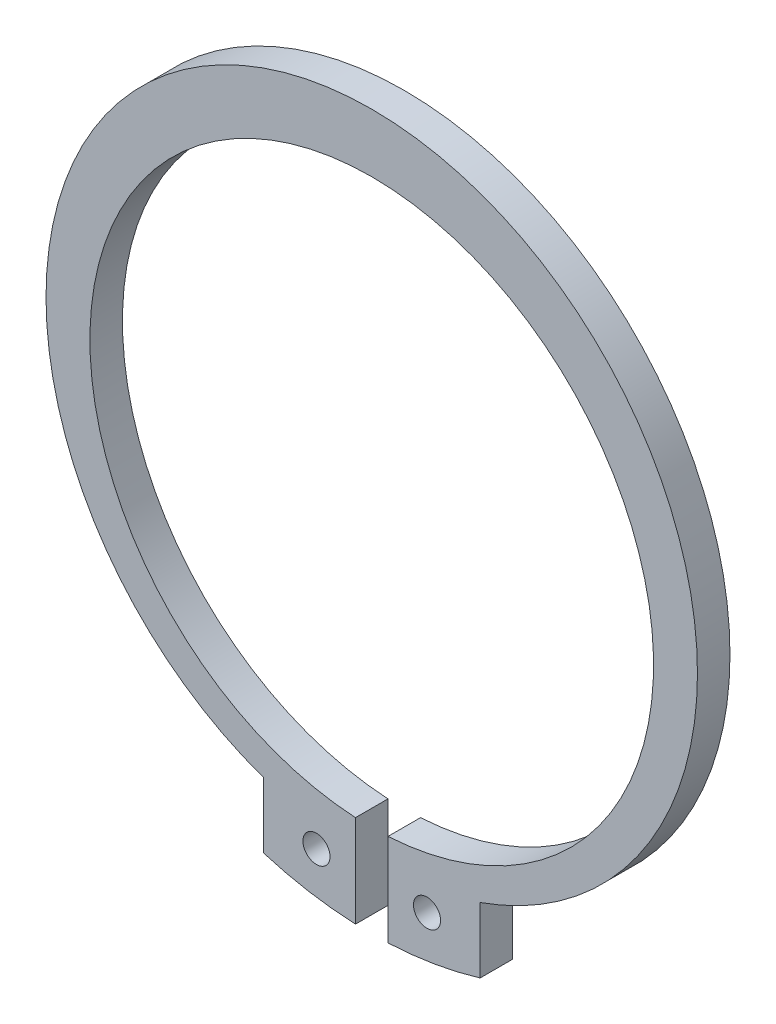
ISO-10303-21;
HEADER;
FILE_DESCRIPTION(('STEP AP214'),'2;1');
FILE_NAME('part.step','',(''),(''),'','','');
FILE_SCHEMA(('AUTOMOTIVE_DESIGN { 1 0 10303 214 1 1 1 1 }'));
ENDSEC;
DATA;
#1=APPLICATION_CONTEXT('core data for automotive mechanical design processes');
#2=APPLICATION_PROTOCOL_DEFINITION('international standard','automotive_design',2000,#1);
#3=PRODUCT_CONTEXT('',#1,'mechanical');
#4=PRODUCT('Part','Part','',(#3));
#5=PRODUCT_RELATED_PRODUCT_CATEGORY('part','',(#4));
#6=PRODUCT_DEFINITION_FORMATION('','',#4);
#7=PRODUCT_DEFINITION_CONTEXT('part definition',#1,'design');
#8=PRODUCT_DEFINITION('design','',#6,#7);
#9=PRODUCT_DEFINITION_SHAPE('','',#8);
#10=(LENGTH_UNIT() NAMED_UNIT(*) SI_UNIT(.MILLI.,.METRE.));
#11=(NAMED_UNIT(*) PLANE_ANGLE_UNIT() SI_UNIT($,.RADIAN.));
#12=(NAMED_UNIT(*) SI_UNIT($,.STERADIAN.) SOLID_ANGLE_UNIT());
#13=UNCERTAINTY_MEASURE_WITH_UNIT(LENGTH_MEASURE(1.E-05),#10,'distance_accuracy_value','');
#14=(GEOMETRIC_REPRESENTATION_CONTEXT(3) GLOBAL_UNCERTAINTY_ASSIGNED_CONTEXT((#13)) GLOBAL_UNIT_ASSIGNED_CONTEXT((#10,
#11,#12)) REPRESENTATION_CONTEXT('',''));
#15=CARTESIAN_POINT('',(0.,0.,0.));
#16=DIRECTION('',(0.,0.,1.));
#17=DIRECTION('',(1.,0.,0.));
#18=AXIS2_PLACEMENT_3D('',#15,#16,#17);
#19=CARTESIAN_POINT('',(-1.5,-34.4673758792282,3.));
#20=DIRECTION('',(-1.,0.,0.));
#21=DIRECTION('',(0.,-1.,0.));
#22=AXIS2_PLACEMENT_3D('',#19,#20,#21);
#23=PLANE('',#22);
#24=DIRECTION('',(0.,1.,0.));
#25=VECTOR('',#24,1.);
#26=CARTESIAN_POINT('',(-1.5,-34.4673758792282,0.));
#27=LINE('',#26,#25);
#28=CARTESIAN_POINT('',(-1.5,-34.4673758792282,0.));
#29=VERTEX_POINT('',#28);
#30=CARTESIAN_POINT('',(-1.5,-25.9566947048348,0.));
#31=VERTEX_POINT('',#30);
#32=EDGE_CURVE('E114',#29,#31,#27,.T.);
#33=ORIENTED_EDGE('',*,*,#32,.T.);
#34=DIRECTION('',(0.,0.,-1.));
#35=VECTOR('',#34,1.);
#36=CARTESIAN_POINT('',(-1.5,-25.9566947048348,3.));
#37=LINE('',#36,#35);
#38=CARTESIAN_POINT('',(-1.5,-25.9566947048348,3.));
#39=VERTEX_POINT('',#38);
#40=EDGE_CURVE('E13',#39,#31,#37,.T.);
#41=ORIENTED_EDGE('',*,*,#40,.F.);
#42=DIRECTION('',(0.,1.,0.));
#43=VECTOR('',#42,1.);
#44=CARTESIAN_POINT('',(-1.5,-34.4673758792282,3.));
#45=LINE('',#44,#43);
#46=CARTESIAN_POINT('',(-1.5,-34.4673758792282,3.));
#47=VERTEX_POINT('',#46);
#48=EDGE_CURVE('E144',#47,#39,#45,.T.);
#49=ORIENTED_EDGE('',*,*,#48,.F.);
#50=DIRECTION('',(0.,0.,-1.));
#51=VECTOR('',#50,1.);
#52=CARTESIAN_POINT('',(-1.5,-34.4673758792282,3.));
#53=LINE('',#52,#51);
#54=EDGE_CURVE('E167',#47,#29,#53,.T.);
#55=ORIENTED_EDGE('',*,*,#54,.T.);
#56=EDGE_LOOP('',(#33,#41,#49,#55));
#57=FACE_BOUND('',#56,.T.);
#58=ADVANCED_FACE('F27',(#57),#23,.F.);
#59=CARTESIAN_POINT('',(0.,0.,3.));
#60=DIRECTION('',(0.,0.,-1.));
#61=DIRECTION('',(-1.,0.,0.));
#62=AXIS2_PLACEMENT_3D('',#59,#60,#61);
#63=CYLINDRICAL_SURFACE('',#62,26.);
#64=CARTESIAN_POINT('',(0.,0.,0.));
#65=DIRECTION('',(0.,0.,1.));
#66=DIRECTION('',(1.,0.,0.));
#67=AXIS2_PLACEMENT_3D('',#64,#65,#66);
#68=CIRCLE('',#67,26.);
#69=CARTESIAN_POINT('',(1.49999999999997,-25.9566947048349,0.));
#70=VERTEX_POINT('',#69);
#71=EDGE_CURVE('E107',#70,#31,#68,.T.);
#72=ORIENTED_EDGE('',*,*,#71,.F.);
#73=DIRECTION('',(0.,0.,-1.));
#74=VECTOR('',#73,1.);
#75=CARTESIAN_POINT('',(1.49999999999997,-25.9566947048349,3.));
#76=LINE('',#75,#74);
#77=CARTESIAN_POINT('',(1.49999999999997,-25.9566947048349,3.));
#78=VERTEX_POINT('',#77);
#79=EDGE_CURVE('E36',#78,#70,#76,.T.);
#80=ORIENTED_EDGE('',*,*,#79,.F.);
#81=CARTESIAN_POINT('',(0.,0.,3.));
#82=DIRECTION('',(0.,0.,1.));
#83=DIRECTION('',(1.,0.,0.));
#84=AXIS2_PLACEMENT_3D('',#81,#82,#83);
#85=CIRCLE('',#84,26.);
#86=EDGE_CURVE('E148',#78,#39,#85,.T.);
#87=ORIENTED_EDGE('',*,*,#86,.T.);
#88=ORIENTED_EDGE('',*,*,#40,.T.);
#89=EDGE_LOOP('',(#72,#80,#87,#88));
#90=FACE_BOUND('',#89,.T.);
#91=ADVANCED_FACE('F108',(#90),#63,.F.);
#92=CARTESIAN_POINT('',(1.49999999999997,-34.4673758792282,3.));
#93=DIRECTION('',(-1.,0.,0.));
#94=DIRECTION('',(0.,-1.,0.));
#95=AXIS2_PLACEMENT_3D('',#92,#93,#94);
#96=PLANE('',#95);
#97=DIRECTION('',(0.,1.,0.));
#98=VECTOR('',#97,1.);
#99=CARTESIAN_POINT('',(1.49999999999997,-34.4673758792282,0.));
#100=LINE('',#99,#98);
#101=CARTESIAN_POINT('',(1.49999999999997,-34.4673758792282,0.));
#102=VERTEX_POINT('',#101);
#103=EDGE_CURVE('E97',#102,#70,#100,.T.);
#104=ORIENTED_EDGE('',*,*,#103,.F.);
#105=DIRECTION('',(0.,0.,-1.));
#106=VECTOR('',#105,1.);
#107=CARTESIAN_POINT('',(1.49999999999997,-34.4673758792282,3.));
#108=LINE('',#107,#106);
#109=CARTESIAN_POINT('',(1.49999999999997,-34.4673758792282,3.));
#110=VERTEX_POINT('',#109);
#111=EDGE_CURVE('E104',#110,#102,#108,.T.);
#112=ORIENTED_EDGE('',*,*,#111,.F.);
#113=DIRECTION('',(0.,1.,0.));
#114=VECTOR('',#113,1.);
#115=CARTESIAN_POINT('',(1.49999999999997,-34.4673758792282,3.));
#116=LINE('',#115,#114);
#117=EDGE_CURVE('E99',#110,#78,#116,.T.);
#118=ORIENTED_EDGE('',*,*,#117,.T.);
#119=ORIENTED_EDGE('',*,*,#79,.T.);
#120=EDGE_LOOP('',(#104,#112,#118,#119));
#121=FACE_BOUND('',#120,.T.);
#122=ADVANCED_FACE('F95',(#121),#96,.T.);
#123=CARTESIAN_POINT('',(0.,0.,3.));
#124=DIRECTION('',(0.,0.,-1.));
#125=DIRECTION('',(-1.,0.,0.));
#126=AXIS2_PLACEMENT_3D('',#123,#124,#125);
#127=CYLINDRICAL_SURFACE('',#126,34.5);
#128=CARTESIAN_POINT('',(0.,0.,0.));
#129=DIRECTION('',(0.,0.,1.));
#130=DIRECTION('',(1.,0.,0.));
#131=AXIS2_PLACEMENT_3D('',#128,#129,#130);
#132=CIRCLE('',#131,34.5);
#133=CARTESIAN_POINT('',(10.,-33.0189339621981,0.));
#134=VERTEX_POINT('',#133);
#135=EDGE_CURVE('E119',#102,#134,#132,.T.);
#136=ORIENTED_EDGE('',*,*,#135,.T.);
#137=DIRECTION('',(0.,0.,-1.));
#138=VECTOR('',#137,1.);
#139=CARTESIAN_POINT('',(10.,-33.0189339621981,3.));
#140=LINE('',#139,#138);
#141=CARTESIAN_POINT('',(10.,-33.0189339621981,3.));
#142=VERTEX_POINT('',#141);
#143=EDGE_CURVE('E182',#142,#134,#140,.T.);
#144=ORIENTED_EDGE('',*,*,#143,.F.);
#145=CARTESIAN_POINT('',(0.,0.,3.));
#146=DIRECTION('',(0.,0.,1.));
#147=DIRECTION('',(1.,0.,0.));
#148=AXIS2_PLACEMENT_3D('',#145,#146,#147);
#149=CIRCLE('',#148,34.5);
#150=EDGE_CURVE('E153',#110,#142,#149,.T.);
#151=ORIENTED_EDGE('',*,*,#150,.F.);
#152=ORIENTED_EDGE('',*,*,#111,.T.);
#153=EDGE_LOOP('',(#136,#144,#151,#152));
#154=FACE_BOUND('',#153,.T.);
#155=ADVANCED_FACE('F241',(#154),#127,.T.);
#156=CARTESIAN_POINT('',(10.,-33.0189339621981,3.));
#157=DIRECTION('',(-1.,0.,0.));
#158=DIRECTION('',(0.,0.,1.));
#159=AXIS2_PLACEMENT_3D('',#156,#157,#158);
#160=PLANE('',#159);
#161=DIRECTION('',(0.,1.,0.));
#162=VECTOR('',#161,1.);
#163=CARTESIAN_POINT('',(10.,-33.0189339621981,0.));
#164=LINE('',#163,#162);
#165=CARTESIAN_POINT('',(10.,-26.9872987421173,0.));
#166=VERTEX_POINT('',#165);
#167=EDGE_CURVE('E127',#134,#166,#164,.T.);
#168=ORIENTED_EDGE('',*,*,#167,.T.);
#169=DIRECTION('',(0.,0.,-1.));
#170=VECTOR('',#169,1.);
#171=CARTESIAN_POINT('',(10.,-26.9872987421173,3.));
#172=LINE('',#171,#170);
#173=CARTESIAN_POINT('',(10.,-26.9872987421173,3.));
#174=VERTEX_POINT('',#173);
#175=EDGE_CURVE('E178',#174,#166,#172,.T.);
#176=ORIENTED_EDGE('',*,*,#175,.F.);
#177=DIRECTION('',(0.,1.,0.));
#178=VECTOR('',#177,1.);
#179=CARTESIAN_POINT('',(10.,-33.0189339621981,3.));
#180=LINE('',#179,#178);
#181=EDGE_CURVE('E156',#142,#174,#180,.T.);
#182=ORIENTED_EDGE('',*,*,#181,.F.);
#183=ORIENTED_EDGE('',*,*,#143,.T.);
#184=EDGE_LOOP('',(#168,#176,#182,#183));
#185=FACE_BOUND('',#184,.T.);
#186=ADVANCED_FACE('F236',(#185),#160,.F.);
#187=CARTESIAN_POINT('',(0.,1.35,3.));
#188=DIRECTION('',(0.,0.,-1.));
#189=DIRECTION('',(-1.,0.,0.));
#190=AXIS2_PLACEMENT_3D('',#187,#188,#189);
#191=CYLINDRICAL_SURFACE('',#190,30.05);
#192=CARTESIAN_POINT('',(0.,1.35,0.));
#193=DIRECTION('',(0.,0.,1.));
#194=DIRECTION('',(1.,0.,0.));
#195=AXIS2_PLACEMENT_3D('',#192,#193,#194);
#196=CIRCLE('',#195,30.05);
#197=CARTESIAN_POINT('',(-10.,-26.9872987421173,0.));
#198=VERTEX_POINT('',#197);
#199=EDGE_CURVE('E133',#166,#198,#196,.T.);
#200=ORIENTED_EDGE('',*,*,#199,.T.);
#201=DIRECTION('',(0.,0.,-1.));
#202=VECTOR('',#201,1.);
#203=CARTESIAN_POINT('',(-10.,-26.9872987421173,3.));
#204=LINE('',#203,#202);
#205=CARTESIAN_POINT('',(-10.,-26.9872987421173,3.));
#206=VERTEX_POINT('',#205);
#207=EDGE_CURVE('E175',#206,#198,#204,.T.);
#208=ORIENTED_EDGE('',*,*,#207,.F.);
#209=CARTESIAN_POINT('',(0.,1.35,3.));
#210=DIRECTION('',(0.,0.,1.));
#211=DIRECTION('',(1.,0.,0.));
#212=AXIS2_PLACEMENT_3D('',#209,#210,#211);
#213=CIRCLE('',#212,30.05);
#214=EDGE_CURVE('E159',#174,#206,#213,.T.);
#215=ORIENTED_EDGE('',*,*,#214,.F.);
#216=ORIENTED_EDGE('',*,*,#175,.T.);
#217=EDGE_LOOP('',(#200,#208,#215,#216));
#218=FACE_BOUND('',#217,.T.);
#219=ADVANCED_FACE('F233',(#218),#191,.T.);
#220=CARTESIAN_POINT('',(-10.,-33.0189339621981,3.));
#221=DIRECTION('',(-1.,0.,0.));
#222=DIRECTION('',(0.,0.,1.));
#223=AXIS2_PLACEMENT_3D('',#220,#221,#222);
#224=PLANE('',#223);
#225=DIRECTION('',(0.,1.,0.));
#226=VECTOR('',#225,1.);
#227=CARTESIAN_POINT('',(-10.,-33.0189339621981,0.));
#228=LINE('',#227,#226);
#229=CARTESIAN_POINT('',(-10.,-33.0189339621981,0.));
#230=VERTEX_POINT('',#229);
#231=EDGE_CURVE('E137',#230,#198,#228,.T.);
#232=ORIENTED_EDGE('',*,*,#231,.F.);
#233=DIRECTION('',(0.,0.,-1.));
#234=VECTOR('',#233,1.);
#235=CARTESIAN_POINT('',(-10.,-33.0189339621981,3.));
#236=LINE('',#235,#234);
#237=CARTESIAN_POINT('',(-10.,-33.0189339621981,3.));
#238=VERTEX_POINT('',#237);
#239=EDGE_CURVE('E52',#238,#230,#236,.T.);
#240=ORIENTED_EDGE('',*,*,#239,.F.);
#241=DIRECTION('',(0.,1.,0.));
#242=VECTOR('',#241,1.);
#243=CARTESIAN_POINT('',(-10.,-33.0189339621981,3.));
#244=LINE('',#243,#242);
#245=EDGE_CURVE('E162',#238,#206,#244,.T.);
#246=ORIENTED_EDGE('',*,*,#245,.T.);
#247=ORIENTED_EDGE('',*,*,#207,.T.);
#248=EDGE_LOOP('',(#232,#240,#246,#247));
#249=FACE_BOUND('',#248,.T.);
#250=ADVANCED_FACE('F229',(#249),#224,.T.);
#251=CARTESIAN_POINT('',(0.,0.,3.));
#252=DIRECTION('',(0.,0.,-1.));
#253=DIRECTION('',(-1.,0.,0.));
#254=AXIS2_PLACEMENT_3D('',#251,#252,#253);
#255=CYLINDRICAL_SURFACE('',#254,34.5);
#256=CARTESIAN_POINT('',(0.,0.,0.));
#257=DIRECTION('',(0.,0.,1.));
#258=DIRECTION('',(1.,0.,0.));
#259=AXIS2_PLACEMENT_3D('',#256,#257,#258);
#260=CIRCLE('',#259,34.5);
#261=EDGE_CURVE('E141',#230,#29,#260,.T.);
#262=ORIENTED_EDGE('',*,*,#261,.T.);
#263=ORIENTED_EDGE('',*,*,#54,.F.);
#264=CARTESIAN_POINT('',(0.,0.,3.));
#265=DIRECTION('',(0.,0.,1.));
#266=DIRECTION('',(1.,0.,0.));
#267=AXIS2_PLACEMENT_3D('',#264,#265,#266);
#268=CIRCLE('',#267,34.5);
#269=EDGE_CURVE('E44',#238,#47,#268,.T.);
#270=ORIENTED_EDGE('',*,*,#269,.F.);
#271=ORIENTED_EDGE('',*,*,#239,.T.);
#272=EDGE_LOOP('',(#262,#263,#270,#271));
#273=FACE_BOUND('',#272,.T.);
#274=ADVANCED_FACE('F244',(#273),#255,.T.);
#275=CARTESIAN_POINT('',(0.,0.,3.));
#276=DIRECTION('',(0.,0.,1.));
#277=DIRECTION('',(1.,0.,0.));
#278=AXIS2_PLACEMENT_3D('',#275,#276,#277);
#279=PLANE('',#278);
#280=CARTESIAN_POINT('',(5.09999999999999,-30.25,3.));
#281=DIRECTION('',(0.,0.,1.));
#282=DIRECTION('',(1.,0.,0.));
#283=AXIS2_PLACEMENT_3D('',#280,#281,#282);
#284=CIRCLE('',#283,1.25);
#285=CARTESIAN_POINT('',(6.34999999999999,-30.25,3.));
#286=VERTEX_POINT('',#285);
#287=EDGE_CURVE('E189',#286,#286,#284,.T.);
#288=ORIENTED_EDGE('',*,*,#287,.F.);
#289=EDGE_LOOP('',(#288));
#290=FACE_BOUND('',#289,.T.);
#291=CARTESIAN_POINT('',(-5.09999999999999,-30.25,3.));
#292=DIRECTION('',(0.,0.,1.));
#293=DIRECTION('',(1.,0.,0.));
#294=AXIS2_PLACEMENT_3D('',#291,#292,#293);
#295=CIRCLE('',#294,1.25);
#296=CARTESIAN_POINT('',(-3.84999999999999,-30.25,3.));
#297=VERTEX_POINT('',#296);
#298=EDGE_CURVE('E147',#297,#297,#295,.T.);
#299=ORIENTED_EDGE('',*,*,#298,.F.);
#300=EDGE_LOOP('',(#299));
#301=FACE_BOUND('',#300,.T.);
#302=ORIENTED_EDGE('',*,*,#48,.T.);
#303=ORIENTED_EDGE('',*,*,#86,.F.);
#304=ORIENTED_EDGE('',*,*,#117,.F.);
#305=ORIENTED_EDGE('',*,*,#150,.T.);
#306=ORIENTED_EDGE('',*,*,#181,.T.);
#307=ORIENTED_EDGE('',*,*,#214,.T.);
#308=ORIENTED_EDGE('',*,*,#245,.F.);
#309=ORIENTED_EDGE('',*,*,#269,.T.);
#310=EDGE_LOOP('',(#302,#303,#304,#305,#306,#307,#308,#309));
#311=FACE_BOUND('',#310,.T.);
#312=ADVANCED_FACE('F242',(#290,#301,#311),#279,.T.);
#313=CARTESIAN_POINT('',(0.,0.,0.));
#314=DIRECTION('',(0.,0.,1.));
#315=DIRECTION('',(1.,0.,0.));
#316=AXIS2_PLACEMENT_3D('',#313,#314,#315);
#317=PLANE('',#316);
#318=CARTESIAN_POINT('',(5.09999999999999,-30.25,0.));
#319=DIRECTION('',(0.,0.,1.));
#320=DIRECTION('',(1.,0.,0.));
#321=AXIS2_PLACEMENT_3D('',#318,#319,#320);
#322=CIRCLE('',#321,1.25);
#323=CARTESIAN_POINT('',(6.34999999999999,-30.25,0.));
#324=VERTEX_POINT('',#323);
#325=EDGE_CURVE('E30',#324,#324,#322,.T.);
#326=ORIENTED_EDGE('',*,*,#325,.T.);
#327=EDGE_LOOP('',(#326));
#328=FACE_BOUND('',#327,.T.);
#329=CARTESIAN_POINT('',(-5.09999999999999,-30.25,0.));
#330=DIRECTION('',(0.,0.,1.));
#331=DIRECTION('',(1.,0.,0.));
#332=AXIS2_PLACEMENT_3D('',#329,#330,#331);
#333=CIRCLE('',#332,1.25);
#334=CARTESIAN_POINT('',(-3.84999999999999,-30.25,0.));
#335=VERTEX_POINT('',#334);
#336=EDGE_CURVE('E186',#335,#335,#333,.T.);
#337=ORIENTED_EDGE('',*,*,#336,.T.);
#338=EDGE_LOOP('',(#337));
#339=FACE_BOUND('',#338,.T.);
#340=ORIENTED_EDGE('',*,*,#32,.F.);
#341=ORIENTED_EDGE('',*,*,#261,.F.);
#342=ORIENTED_EDGE('',*,*,#231,.T.);
#343=ORIENTED_EDGE('',*,*,#199,.F.);
#344=ORIENTED_EDGE('',*,*,#167,.F.);
#345=ORIENTED_EDGE('',*,*,#135,.F.);
#346=ORIENTED_EDGE('',*,*,#103,.T.);
#347=ORIENTED_EDGE('',*,*,#71,.T.);
#348=EDGE_LOOP('',(#340,#341,#342,#343,#344,#345,#346,#347));
#349=FACE_BOUND('',#348,.T.);
#350=ADVANCED_FACE('F117',(#328,#339,#349),#317,.F.);
#351=CARTESIAN_POINT('',(-5.09999999999999,-30.25,-3.));
#352=DIRECTION('',(0.,0.,1.));
#353=DIRECTION('',(0.,1.,0.));
#354=AXIS2_PLACEMENT_3D('',#351,#352,#353);
#355=CYLINDRICAL_SURFACE('',#354,1.25);
#356=ORIENTED_EDGE('',*,*,#298,.T.);
#357=EDGE_LOOP('',(#356));
#358=FACE_BOUND('',#357,.T.);
#359=ORIENTED_EDGE('',*,*,#336,.F.);
#360=EDGE_LOOP('',(#359));
#361=FACE_BOUND('',#360,.T.);
#362=ADVANCED_FACE('F212',(#358,#361),#355,.F.);
#363=CARTESIAN_POINT('',(5.09999999999999,-30.25,-3.));
#364=DIRECTION('',(0.,0.,1.));
#365=DIRECTION('',(0.,1.,0.));
#366=AXIS2_PLACEMENT_3D('',#363,#364,#365);
#367=CYLINDRICAL_SURFACE('',#366,1.25);
#368=ORIENTED_EDGE('',*,*,#287,.T.);
#369=EDGE_LOOP('',(#368));
#370=FACE_BOUND('',#369,.T.);
#371=ORIENTED_EDGE('',*,*,#325,.F.);
#372=EDGE_LOOP('',(#371));
#373=FACE_BOUND('',#372,.T.);
#374=ADVANCED_FACE('F210',(#370,#373),#367,.F.);
#375=CLOSED_SHELL('',(#58,#91,#122,#155,#186,#219,#250,#274,#312,#350,#362,#374));
#376=MANIFOLD_SOLID_BREP('B1',#375);
#377=ADVANCED_BREP_SHAPE_REPRESENTATION('',(#18,#376),#14);
#378=SHAPE_DEFINITION_REPRESENTATION(#9,#377);
ENDSEC;
END-ISO-10303-21;
